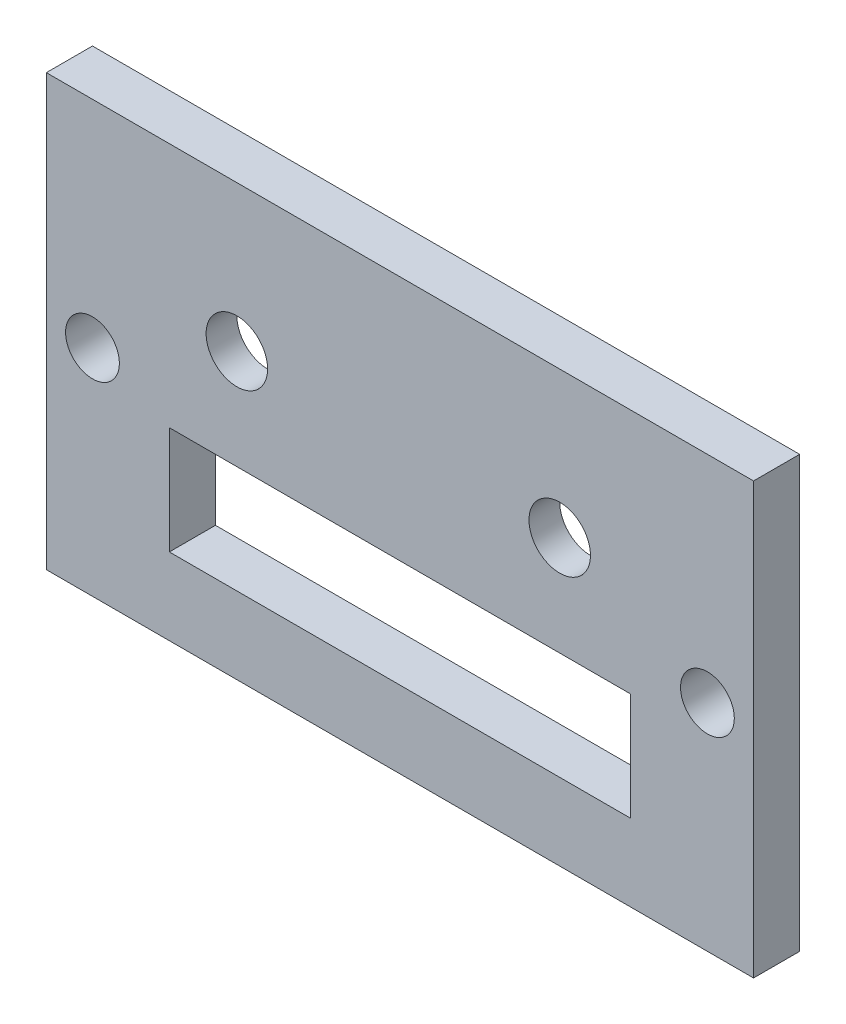
ISO-10303-21;
HEADER;
FILE_DESCRIPTION(('STEP AP214'),'2;1');
FILE_NAME('part.step','',(''),(''),'','','');
FILE_SCHEMA(('AUTOMOTIVE_DESIGN { 1 0 10303 214 1 1 1 1 }'));
ENDSEC;
DATA;
#1=APPLICATION_CONTEXT('core data for automotive mechanical design processes');
#2=APPLICATION_PROTOCOL_DEFINITION('international standard','automotive_design',2000,#1);
#3=PRODUCT_CONTEXT('',#1,'mechanical');
#4=PRODUCT('Part','Part','',(#3));
#5=PRODUCT_RELATED_PRODUCT_CATEGORY('part','',(#4));
#6=PRODUCT_DEFINITION_FORMATION('','',#4);
#7=PRODUCT_DEFINITION_CONTEXT('part definition',#1,'design');
#8=PRODUCT_DEFINITION('design','',#6,#7);
#9=PRODUCT_DEFINITION_SHAPE('','',#8);
#10=(LENGTH_UNIT() NAMED_UNIT(*) SI_UNIT(.MILLI.,.METRE.));
#11=(NAMED_UNIT(*) PLANE_ANGLE_UNIT() SI_UNIT($,.RADIAN.));
#12=(NAMED_UNIT(*) SI_UNIT($,.STERADIAN.) SOLID_ANGLE_UNIT());
#13=UNCERTAINTY_MEASURE_WITH_UNIT(LENGTH_MEASURE(1.E-05),#10,'distance_accuracy_value','');
#14=(GEOMETRIC_REPRESENTATION_CONTEXT(3) GLOBAL_UNCERTAINTY_ASSIGNED_CONTEXT((#13)) GLOBAL_UNIT_ASSIGNED_CONTEXT((#10,
#11,#12)) REPRESENTATION_CONTEXT('',''));
#15=CARTESIAN_POINT('',(0.,0.,0.));
#16=DIRECTION('',(0.,0.,1.));
#17=DIRECTION('',(1.,0.,0.));
#18=AXIS2_PLACEMENT_3D('',#15,#16,#17);
#19=CARTESIAN_POINT('',(0.,0.,2.));
#20=DIRECTION('',(0.,0.,1.));
#21=DIRECTION('',(1.,0.,0.));
#22=AXIS2_PLACEMENT_3D('',#19,#20,#21);
#23=PLANE('',#22);
#24=DIRECTION('',(0.,-1.,0.));
#25=VECTOR('',#24,1.);
#26=CARTESIAN_POINT('',(-15.,0.,2.));
#27=LINE('',#26,#25);
#28=CARTESIAN_POINT('',(-15.,-5.,2.));
#29=VERTEX_POINT('',#28);
#30=CARTESIAN_POINT('',(-15.,-12.,2.));
#31=VERTEX_POINT('',#30);
#32=EDGE_CURVE('E136',#29,#31,#27,.T.);
#33=ORIENTED_EDGE('',*,*,#32,.F.);
#34=DIRECTION('',(1.,0.,0.));
#35=VECTOR('',#34,1.);
#36=CARTESIAN_POINT('',(-15.,-5.,2.));
#37=LINE('',#36,#35);
#38=CARTESIAN_POINT('',(15.,-5.,2.));
#39=VERTEX_POINT('',#38);
#40=EDGE_CURVE('E246',#29,#39,#37,.T.);
#41=ORIENTED_EDGE('',*,*,#40,.T.);
#42=DIRECTION('',(0.,1.,0.));
#43=VECTOR('',#42,1.);
#44=CARTESIAN_POINT('',(15.,0.,2.));
#45=LINE('',#44,#43);
#46=CARTESIAN_POINT('',(15.,-12.,2.));
#47=VERTEX_POINT('',#46);
#48=EDGE_CURVE('E187',#47,#39,#45,.T.);
#49=ORIENTED_EDGE('',*,*,#48,.F.);
#50=DIRECTION('',(1.,0.,0.));
#51=VECTOR('',#50,1.);
#52=CARTESIAN_POINT('',(0.,-12.,2.));
#53=LINE('',#52,#51);
#54=EDGE_CURVE('E182',#31,#47,#53,.T.);
#55=ORIENTED_EDGE('',*,*,#54,.F.);
#56=EDGE_LOOP('',(#33,#41,#49,#55));
#57=FACE_BOUND('',#56,.T.);
#58=CARTESIAN_POINT('',(-10.6076951545867,1.5,2.));
#59=DIRECTION('',(0.,0.,1.));
#60=DIRECTION('',(1.,0.,0.));
#61=AXIS2_PLACEMENT_3D('',#58,#59,#60);
#62=CIRCLE('',#61,2.);
#63=CARTESIAN_POINT('',(-8.60769515458674,1.5,2.));
#64=VERTEX_POINT('',#63);
#65=EDGE_CURVE('E238',#64,#64,#62,.T.);
#66=ORIENTED_EDGE('',*,*,#65,.F.);
#67=EDGE_LOOP('',(#66));
#68=FACE_BOUND('',#67,.T.);
#69=CARTESIAN_POINT('',(10.3923048454133,1.5,2.));
#70=DIRECTION('',(0.,0.,1.));
#71=DIRECTION('',(1.,0.,0.));
#72=AXIS2_PLACEMENT_3D('',#69,#70,#71);
#73=CIRCLE('',#72,2.);
#74=CARTESIAN_POINT('',(12.3923048454133,1.5,2.));
#75=VERTEX_POINT('',#74);
#76=EDGE_CURVE('E230',#75,#75,#73,.T.);
#77=ORIENTED_EDGE('',*,*,#76,.F.);
#78=EDGE_LOOP('',(#77));
#79=FACE_BOUND('',#78,.T.);
#80=CARTESIAN_POINT('',(20.,-3.,2.));
#81=DIRECTION('',(0.,0.,1.));
#82=DIRECTION('',(1.,0.,0.));
#83=AXIS2_PLACEMENT_3D('',#80,#81,#82);
#84=CIRCLE('',#83,1.75);
#85=CARTESIAN_POINT('',(21.75,-3.,2.));
#86=VERTEX_POINT('',#85);
#87=EDGE_CURVE('E190',#86,#86,#84,.T.);
#88=ORIENTED_EDGE('',*,*,#87,.F.);
#89=EDGE_LOOP('',(#88));
#90=FACE_BOUND('',#89,.T.);
#91=CARTESIAN_POINT('',(-20.,-3.,2.));
#92=DIRECTION('',(0.,0.,1.));
#93=DIRECTION('',(1.,0.,0.));
#94=AXIS2_PLACEMENT_3D('',#91,#92,#93);
#95=CIRCLE('',#94,1.75);
#96=CARTESIAN_POINT('',(-18.25,-3.,2.));
#97=VERTEX_POINT('',#96);
#98=EDGE_CURVE('E194',#97,#97,#95,.T.);
#99=ORIENTED_EDGE('',*,*,#98,.F.);
#100=EDGE_LOOP('',(#99));
#101=FACE_BOUND('',#100,.T.);
#102=DIRECTION('',(1.,0.,0.));
#103=VECTOR('',#102,1.);
#104=CARTESIAN_POINT('',(0.,-17.,2.));
#105=LINE('',#104,#103);
#106=CARTESIAN_POINT('',(-23.,-17.,2.));
#107=VERTEX_POINT('',#106);
#108=CARTESIAN_POINT('',(23.,-17.,2.));
#109=VERTEX_POINT('',#108);
#110=EDGE_CURVE('E198',#107,#109,#105,.T.);
#111=ORIENTED_EDGE('',*,*,#110,.T.);
#112=DIRECTION('',(0.,1.,0.));
#113=VECTOR('',#112,1.);
#114=CARTESIAN_POINT('',(23.,0.,2.));
#115=LINE('',#114,#113);
#116=CARTESIAN_POINT('',(23.,11.,2.));
#117=VERTEX_POINT('',#116);
#118=EDGE_CURVE('E202',#109,#117,#115,.T.);
#119=ORIENTED_EDGE('',*,*,#118,.T.);
#120=DIRECTION('',(1.,0.,0.));
#121=VECTOR('',#120,1.);
#122=CARTESIAN_POINT('',(0.,11.,2.));
#123=LINE('',#122,#121);
#124=CARTESIAN_POINT('',(-23.,11.,2.));
#125=VERTEX_POINT('',#124);
#126=EDGE_CURVE('E152',#125,#117,#123,.T.);
#127=ORIENTED_EDGE('',*,*,#126,.F.);
#128=DIRECTION('',(0.,1.,0.));
#129=VECTOR('',#128,1.);
#130=CARTESIAN_POINT('',(-23.,0.,2.));
#131=LINE('',#130,#129);
#132=EDGE_CURVE('E148',#107,#125,#131,.T.);
#133=ORIENTED_EDGE('',*,*,#132,.F.);
#134=EDGE_LOOP('',(#111,#119,#127,#133));
#135=FACE_BOUND('',#134,.T.);
#136=ADVANCED_FACE('F41',(#57,#68,#79,#90,#101,#135),#23,.T.);
#137=CARTESIAN_POINT('',(0.,0.,0.));
#138=DIRECTION('',(0.,0.,1.));
#139=DIRECTION('',(1.,0.,0.));
#140=AXIS2_PLACEMENT_3D('',#137,#138,#139);
#141=PLANE('',#140);
#142=DIRECTION('',(0.,-1.,0.));
#143=VECTOR('',#142,1.);
#144=CARTESIAN_POINT('',(-15.,6.,0.));
#145=LINE('',#144,#143);
#146=CARTESIAN_POINT('',(-15.,6.,0.));
#147=VERTEX_POINT('',#146);
#148=CARTESIAN_POINT('',(-15.,-5.,0.));
#149=VERTEX_POINT('',#148);
#150=EDGE_CURVE('E242',#147,#149,#145,.T.);
#151=ORIENTED_EDGE('',*,*,#150,.F.);
#152=DIRECTION('',(-1.,0.,0.));
#153=VECTOR('',#152,1.);
#154=CARTESIAN_POINT('',(-15.,6.,0.));
#155=LINE('',#154,#153);
#156=CARTESIAN_POINT('',(15.,6.,0.));
#157=VERTEX_POINT('',#156);
#158=EDGE_CURVE('E250',#157,#147,#155,.T.);
#159=ORIENTED_EDGE('',*,*,#158,.F.);
#160=DIRECTION('',(0.,1.,0.));
#161=VECTOR('',#160,1.);
#162=CARTESIAN_POINT('',(15.,6.,0.));
#163=LINE('',#162,#161);
#164=CARTESIAN_POINT('',(15.,-5.,0.));
#165=VERTEX_POINT('',#164);
#166=EDGE_CURVE('E61',#165,#157,#163,.T.);
#167=ORIENTED_EDGE('',*,*,#166,.F.);
#168=DIRECTION('',(1.,0.,0.));
#169=VECTOR('',#168,1.);
#170=CARTESIAN_POINT('',(-15.,-5.,0.));
#171=LINE('',#170,#169);
#172=EDGE_CURVE('E253',#149,#165,#171,.T.);
#173=ORIENTED_EDGE('',*,*,#172,.F.);
#174=EDGE_LOOP('',(#151,#159,#167,#173));
#175=FACE_BOUND('',#174,.T.);
#176=CARTESIAN_POINT('',(-10.6076951545867,1.5,0.));
#177=DIRECTION('',(0.,0.,1.));
#178=DIRECTION('',(1.,0.,0.));
#179=AXIS2_PLACEMENT_3D('',#176,#177,#178);
#180=CIRCLE('',#179,2.);
#181=CARTESIAN_POINT('',(-8.60769515458674,1.5,0.));
#182=VERTEX_POINT('',#181);
#183=EDGE_CURVE('E234',#182,#182,#180,.T.);
#184=ORIENTED_EDGE('',*,*,#183,.T.);
#185=EDGE_LOOP('',(#184));
#186=FACE_BOUND('',#185,.T.);
#187=CARTESIAN_POINT('',(10.3923048454133,1.5,0.));
#188=DIRECTION('',(0.,0.,1.));
#189=DIRECTION('',(1.,0.,0.));
#190=AXIS2_PLACEMENT_3D('',#187,#188,#189);
#191=CIRCLE('',#190,2.);
#192=CARTESIAN_POINT('',(12.3923048454133,1.5,0.));
#193=VERTEX_POINT('',#192);
#194=EDGE_CURVE('E212',#193,#193,#191,.T.);
#195=ORIENTED_EDGE('',*,*,#194,.T.);
#196=EDGE_LOOP('',(#195));
#197=FACE_BOUND('',#196,.T.);
#198=ADVANCED_FACE('F266',(#175,#186,#197),#141,.F.);
#199=CARTESIAN_POINT('',(-15.,-5.,2.));
#200=DIRECTION('',(0.,1.,0.));
#201=DIRECTION('',(0.,0.,1.));
#202=AXIS2_PLACEMENT_3D('',#199,#200,#201);
#203=PLANE('',#202);
#204=ORIENTED_EDGE('',*,*,#172,.T.);
#205=DIRECTION('',(0.,0.,-1.));
#206=VECTOR('',#205,1.);
#207=CARTESIAN_POINT('',(15.,-5.,2.));
#208=LINE('',#207,#206);
#209=EDGE_CURVE('E50',#39,#165,#208,.T.);
#210=ORIENTED_EDGE('',*,*,#209,.F.);
#211=ORIENTED_EDGE('',*,*,#40,.F.);
#212=DIRECTION('',(0.,0.,-1.));
#213=VECTOR('',#212,1.);
#214=CARTESIAN_POINT('',(-15.,-5.,2.));
#215=LINE('',#214,#213);
#216=EDGE_CURVE('E11',#29,#149,#215,.T.);
#217=ORIENTED_EDGE('',*,*,#216,.T.);
#218=EDGE_LOOP('',(#204,#210,#211,#217));
#219=FACE_BOUND('',#218,.T.);
#220=ADVANCED_FACE('F43',(#219),#203,.F.);
#221=CARTESIAN_POINT('',(-10.6076951545867,1.5,2.));
#222=DIRECTION('',(0.,0.,-1.));
#223=DIRECTION('',(-1.,0.,0.));
#224=AXIS2_PLACEMENT_3D('',#221,#222,#223);
#225=CYLINDRICAL_SURFACE('',#224,2.);
#226=ORIENTED_EDGE('',*,*,#65,.T.);
#227=EDGE_LOOP('',(#226));
#228=FACE_BOUND('',#227,.T.);
#229=ORIENTED_EDGE('',*,*,#183,.F.);
#230=EDGE_LOOP('',(#229));
#231=FACE_BOUND('',#230,.T.);
#232=ADVANCED_FACE('F290',(#228,#231),#225,.F.);
#233=CARTESIAN_POINT('',(10.3923048454133,1.5,2.));
#234=DIRECTION('',(0.,0.,-1.));
#235=DIRECTION('',(-1.,0.,0.));
#236=AXIS2_PLACEMENT_3D('',#233,#234,#235);
#237=CYLINDRICAL_SURFACE('',#236,2.);
#238=ORIENTED_EDGE('',*,*,#76,.T.);
#239=EDGE_LOOP('',(#238));
#240=FACE_BOUND('',#239,.T.);
#241=ORIENTED_EDGE('',*,*,#194,.F.);
#242=EDGE_LOOP('',(#241));
#243=FACE_BOUND('',#242,.T.);
#244=ADVANCED_FACE('F281',(#240,#243),#237,.F.);
#245=CARTESIAN_POINT('',(0.,6.,-1.));
#246=DIRECTION('',(0.,1.,0.));
#247=DIRECTION('',(0.,0.,1.));
#248=AXIS2_PLACEMENT_3D('',#245,#246,#247);
#249=PLANE('',#248);
#250=DIRECTION('',(0.,0.,1.));
#251=VECTOR('',#250,1.);
#252=CARTESIAN_POINT('',(15.,6.,-1.));
#253=LINE('',#252,#251);
#254=CARTESIAN_POINT('',(15.,6.,-1.));
#255=VERTEX_POINT('',#254);
#256=EDGE_CURVE('E225',#255,#157,#253,.T.);
#257=ORIENTED_EDGE('',*,*,#256,.T.);
#258=ORIENTED_EDGE('',*,*,#158,.T.);
#259=DIRECTION('',(0.,0.,1.));
#260=VECTOR('',#259,1.);
#261=CARTESIAN_POINT('',(-15.,6.,-1.));
#262=LINE('',#261,#260);
#263=CARTESIAN_POINT('',(-15.,6.,-1.));
#264=VERTEX_POINT('',#263);
#265=EDGE_CURVE('E141',#264,#147,#262,.T.);
#266=ORIENTED_EDGE('',*,*,#265,.F.);
#267=DIRECTION('',(-1.,0.,0.));
#268=VECTOR('',#267,1.);
#269=CARTESIAN_POINT('',(0.,6.,-1.));
#270=LINE('',#269,#268);
#271=EDGE_CURVE('E126',#255,#264,#270,.T.);
#272=ORIENTED_EDGE('',*,*,#271,.F.);
#273=EDGE_LOOP('',(#257,#258,#266,#272));
#274=FACE_BOUND('',#273,.T.);
#275=ADVANCED_FACE('F262',(#274),#249,.F.);
#276=CARTESIAN_POINT('',(15.,0.,-1.));
#277=DIRECTION('',(1.,0.,0.));
#278=DIRECTION('',(0.,0.,-1.));
#279=AXIS2_PLACEMENT_3D('',#276,#277,#278);
#280=PLANE('',#279);
#281=ORIENTED_EDGE('',*,*,#209,.T.);
#282=ORIENTED_EDGE('',*,*,#166,.T.);
#283=ORIENTED_EDGE('',*,*,#256,.F.);
#284=DIRECTION('',(0.,1.,0.));
#285=VECTOR('',#284,1.);
#286=CARTESIAN_POINT('',(15.,0.,-1.));
#287=LINE('',#286,#285);
#288=CARTESIAN_POINT('',(15.,-12.,-1.));
#289=VERTEX_POINT('',#288);
#290=EDGE_CURVE('E157',#289,#255,#287,.T.);
#291=ORIENTED_EDGE('',*,*,#290,.F.);
#292=DIRECTION('',(0.,0.,1.));
#293=VECTOR('',#292,1.);
#294=CARTESIAN_POINT('',(15.,-12.,-1.));
#295=LINE('',#294,#293);
#296=EDGE_CURVE('E146',#289,#47,#295,.T.);
#297=ORIENTED_EDGE('',*,*,#296,.T.);
#298=ORIENTED_EDGE('',*,*,#48,.T.);
#299=EDGE_LOOP('',(#281,#282,#283,#291,#297,#298));
#300=FACE_BOUND('',#299,.T.);
#301=ADVANCED_FACE('F272',(#300),#280,.F.);
#302=CARTESIAN_POINT('',(-15.,0.,-1.));
#303=DIRECTION('',(-1.,0.,0.));
#304=DIRECTION('',(0.,0.,1.));
#305=AXIS2_PLACEMENT_3D('',#302,#303,#304);
#306=PLANE('',#305);
#307=ORIENTED_EDGE('',*,*,#265,.T.);
#308=ORIENTED_EDGE('',*,*,#150,.T.);
#309=ORIENTED_EDGE('',*,*,#216,.F.);
#310=ORIENTED_EDGE('',*,*,#32,.T.);
#311=DIRECTION('',(0.,0.,1.));
#312=VECTOR('',#311,1.);
#313=CARTESIAN_POINT('',(-15.,-12.,-1.));
#314=LINE('',#313,#312);
#315=CARTESIAN_POINT('',(-15.,-12.,-1.));
#316=VERTEX_POINT('',#315);
#317=EDGE_CURVE('E133',#316,#31,#314,.T.);
#318=ORIENTED_EDGE('',*,*,#317,.F.);
#319=DIRECTION('',(0.,-1.,0.));
#320=VECTOR('',#319,1.);
#321=CARTESIAN_POINT('',(-15.,0.,-1.));
#322=LINE('',#321,#320);
#323=EDGE_CURVE('E118',#264,#316,#322,.T.);
#324=ORIENTED_EDGE('',*,*,#323,.F.);
#325=EDGE_LOOP('',(#307,#308,#309,#310,#318,#324));
#326=FACE_BOUND('',#325,.T.);
#327=ADVANCED_FACE('F134',(#326),#306,.F.);
#328=CARTESIAN_POINT('',(0.,-17.,-1.));
#329=DIRECTION('',(0.,-1.,0.));
#330=DIRECTION('',(0.,0.,-1.));
#331=AXIS2_PLACEMENT_3D('',#328,#329,#330);
#332=PLANE('',#331);
#333=ORIENTED_EDGE('',*,*,#110,.F.);
#334=DIRECTION('',(0.,0.,1.));
#335=VECTOR('',#334,1.);
#336=CARTESIAN_POINT('',(-23.,-17.,-1.));
#337=LINE('',#336,#335);
#338=CARTESIAN_POINT('',(-23.,-17.,-1.));
#339=VERTEX_POINT('',#338);
#340=EDGE_CURVE('E209',#339,#107,#337,.T.);
#341=ORIENTED_EDGE('',*,*,#340,.F.);
#342=DIRECTION('',(1.,0.,0.));
#343=VECTOR('',#342,1.);
#344=CARTESIAN_POINT('',(0.,-17.,-1.));
#345=LINE('',#344,#343);
#346=CARTESIAN_POINT('',(23.,-17.,-1.));
#347=VERTEX_POINT('',#346);
#348=EDGE_CURVE('E168',#339,#347,#345,.T.);
#349=ORIENTED_EDGE('',*,*,#348,.T.);
#350=DIRECTION('',(0.,0.,1.));
#351=VECTOR('',#350,1.);
#352=CARTESIAN_POINT('',(23.,-17.,-1.));
#353=LINE('',#352,#351);
#354=EDGE_CURVE('E220',#347,#109,#353,.T.);
#355=ORIENTED_EDGE('',*,*,#354,.T.);
#356=EDGE_LOOP('',(#333,#341,#349,#355));
#357=FACE_BOUND('',#356,.T.);
#358=ADVANCED_FACE('F279',(#357),#332,.T.);
#359=CARTESIAN_POINT('',(-23.,0.,-1.));
#360=DIRECTION('',(1.,0.,0.));
#361=DIRECTION('',(0.,0.,-1.));
#362=AXIS2_PLACEMENT_3D('',#359,#360,#361);
#363=PLANE('',#362);
#364=ORIENTED_EDGE('',*,*,#132,.T.);
#365=DIRECTION('',(0.,0.,1.));
#366=VECTOR('',#365,1.);
#367=CARTESIAN_POINT('',(-23.,11.,-1.));
#368=LINE('',#367,#366);
#369=CARTESIAN_POINT('',(-23.,11.,-1.));
#370=VERTEX_POINT('',#369);
#371=EDGE_CURVE('E213',#370,#125,#368,.T.);
#372=ORIENTED_EDGE('',*,*,#371,.F.);
#373=DIRECTION('',(0.,1.,0.));
#374=VECTOR('',#373,1.);
#375=CARTESIAN_POINT('',(-23.,0.,-1.));
#376=LINE('',#375,#374);
#377=EDGE_CURVE('E142',#339,#370,#376,.T.);
#378=ORIENTED_EDGE('',*,*,#377,.F.);
#379=ORIENTED_EDGE('',*,*,#340,.T.);
#380=EDGE_LOOP('',(#364,#372,#378,#379));
#381=FACE_BOUND('',#380,.T.);
#382=ADVANCED_FACE('F307',(#381),#363,.F.);
#383=CARTESIAN_POINT('',(0.,11.,-1.));
#384=DIRECTION('',(0.,-1.,0.));
#385=DIRECTION('',(0.,0.,-1.));
#386=AXIS2_PLACEMENT_3D('',#383,#384,#385);
#387=PLANE('',#386);
#388=ORIENTED_EDGE('',*,*,#126,.T.);
#389=DIRECTION('',(0.,0.,1.));
#390=VECTOR('',#389,1.);
#391=CARTESIAN_POINT('',(23.,11.,-1.));
#392=LINE('',#391,#390);
#393=CARTESIAN_POINT('',(23.,11.,-1.));
#394=VERTEX_POINT('',#393);
#395=EDGE_CURVE('E217',#394,#117,#392,.T.);
#396=ORIENTED_EDGE('',*,*,#395,.F.);
#397=DIRECTION('',(1.,0.,0.));
#398=VECTOR('',#397,1.);
#399=CARTESIAN_POINT('',(0.,11.,-1.));
#400=LINE('',#399,#398);
#401=EDGE_CURVE('E176',#370,#394,#400,.T.);
#402=ORIENTED_EDGE('',*,*,#401,.F.);
#403=ORIENTED_EDGE('',*,*,#371,.T.);
#404=EDGE_LOOP('',(#388,#396,#402,#403));
#405=FACE_BOUND('',#404,.T.);
#406=ADVANCED_FACE('F299',(#405),#387,.F.);
#407=CARTESIAN_POINT('',(0.,-12.,-1.));
#408=DIRECTION('',(0.,-1.,0.));
#409=DIRECTION('',(0.,0.,-1.));
#410=AXIS2_PLACEMENT_3D('',#407,#408,#409);
#411=PLANE('',#410);
#412=ORIENTED_EDGE('',*,*,#54,.T.);
#413=ORIENTED_EDGE('',*,*,#296,.F.);
#414=DIRECTION('',(1.,0.,0.));
#415=VECTOR('',#414,1.);
#416=CARTESIAN_POINT('',(0.,-12.,-1.));
#417=LINE('',#416,#415);
#418=EDGE_CURVE('E123',#316,#289,#417,.T.);
#419=ORIENTED_EDGE('',*,*,#418,.F.);
#420=ORIENTED_EDGE('',*,*,#317,.T.);
#421=EDGE_LOOP('',(#412,#413,#419,#420));
#422=FACE_BOUND('',#421,.T.);
#423=ADVANCED_FACE('F144',(#422),#411,.F.);
#424=CARTESIAN_POINT('',(-20.,-3.,-1.));
#425=DIRECTION('',(0.,0.,1.));
#426=DIRECTION('',(1.,0.,0.));
#427=AXIS2_PLACEMENT_3D('',#424,#425,#426);
#428=CYLINDRICAL_SURFACE('',#427,1.75);
#429=CARTESIAN_POINT('',(-20.,-3.,-1.));
#430=DIRECTION('',(0.,0.,1.));
#431=DIRECTION('',(1.,0.,0.));
#432=AXIS2_PLACEMENT_3D('',#429,#430,#431);
#433=CIRCLE('',#432,1.75);
#434=CARTESIAN_POINT('',(-18.25,-3.,-1.));
#435=VERTEX_POINT('',#434);
#436=EDGE_CURVE('E164',#435,#435,#433,.T.);
#437=ORIENTED_EDGE('',*,*,#436,.F.);
#438=EDGE_LOOP('',(#437));
#439=FACE_BOUND('',#438,.T.);
#440=ORIENTED_EDGE('',*,*,#98,.T.);
#441=EDGE_LOOP('',(#440));
#442=FACE_BOUND('',#441,.T.);
#443=ADVANCED_FACE('F298',(#439,#442),#428,.F.);
#444=CARTESIAN_POINT('',(20.,-3.,-1.));
#445=DIRECTION('',(0.,0.,1.));
#446=DIRECTION('',(1.,0.,0.));
#447=AXIS2_PLACEMENT_3D('',#444,#445,#446);
#448=CYLINDRICAL_SURFACE('',#447,1.75);
#449=CARTESIAN_POINT('',(20.,-3.,-1.));
#450=DIRECTION('',(0.,0.,1.));
#451=DIRECTION('',(1.,0.,0.));
#452=AXIS2_PLACEMENT_3D('',#449,#450,#451);
#453=CIRCLE('',#452,1.75);
#454=CARTESIAN_POINT('',(21.75,-3.,-1.));
#455=VERTEX_POINT('',#454);
#456=EDGE_CURVE('E160',#455,#455,#453,.T.);
#457=ORIENTED_EDGE('',*,*,#456,.F.);
#458=EDGE_LOOP('',(#457));
#459=FACE_BOUND('',#458,.T.);
#460=ORIENTED_EDGE('',*,*,#87,.T.);
#461=EDGE_LOOP('',(#460));
#462=FACE_BOUND('',#461,.T.);
#463=ADVANCED_FACE('F304',(#459,#462),#448,.F.);
#464=CARTESIAN_POINT('',(23.,0.,-1.));
#465=DIRECTION('',(1.,0.,0.));
#466=DIRECTION('',(0.,1.,0.));
#467=AXIS2_PLACEMENT_3D('',#464,#465,#466);
#468=PLANE('',#467);
#469=ORIENTED_EDGE('',*,*,#118,.F.);
#470=ORIENTED_EDGE('',*,*,#354,.F.);
#471=DIRECTION('',(0.,1.,0.));
#472=VECTOR('',#471,1.);
#473=CARTESIAN_POINT('',(23.,0.,-1.));
#474=LINE('',#473,#472);
#475=EDGE_CURVE('E172',#347,#394,#474,.T.);
#476=ORIENTED_EDGE('',*,*,#475,.T.);
#477=ORIENTED_EDGE('',*,*,#395,.T.);
#478=EDGE_LOOP('',(#469,#470,#476,#477));
#479=FACE_BOUND('',#478,.T.);
#480=ADVANCED_FACE('F317',(#479),#468,.T.);
#481=CARTESIAN_POINT('',(0.,0.,-1.));
#482=DIRECTION('',(0.,0.,1.));
#483=DIRECTION('',(1.,0.,0.));
#484=AXIS2_PLACEMENT_3D('',#481,#482,#483);
#485=PLANE('',#484);
#486=ORIENTED_EDGE('',*,*,#418,.T.);
#487=ORIENTED_EDGE('',*,*,#290,.T.);
#488=ORIENTED_EDGE('',*,*,#271,.T.);
#489=ORIENTED_EDGE('',*,*,#323,.T.);
#490=EDGE_LOOP('',(#486,#487,#488,#489));
#491=FACE_BOUND('',#490,.T.);
#492=ORIENTED_EDGE('',*,*,#456,.T.);
#493=EDGE_LOOP('',(#492));
#494=FACE_BOUND('',#493,.T.);
#495=ORIENTED_EDGE('',*,*,#436,.T.);
#496=EDGE_LOOP('',(#495));
#497=FACE_BOUND('',#496,.T.);
#498=ORIENTED_EDGE('',*,*,#348,.F.);
#499=ORIENTED_EDGE('',*,*,#377,.T.);
#500=ORIENTED_EDGE('',*,*,#401,.T.);
#501=ORIENTED_EDGE('',*,*,#475,.F.);
#502=EDGE_LOOP('',(#498,#499,#500,#501));
#503=FACE_BOUND('',#502,.T.);
#504=ADVANCED_FACE('F120',(#491,#494,#497,#503),#485,.F.);
#505=CLOSED_SHELL('',(#136,#198,#220,#232,#244,#275,#301,#327,#358,#382,#406,#423,#443,#463,
#480,#504));
#506=MANIFOLD_SOLID_BREP('B2',#505);
#507=ADVANCED_BREP_SHAPE_REPRESENTATION('',(#18,#506),#14);
#508=SHAPE_DEFINITION_REPRESENTATION(#9,#507);
ENDSEC;
END-ISO-10303-21;
